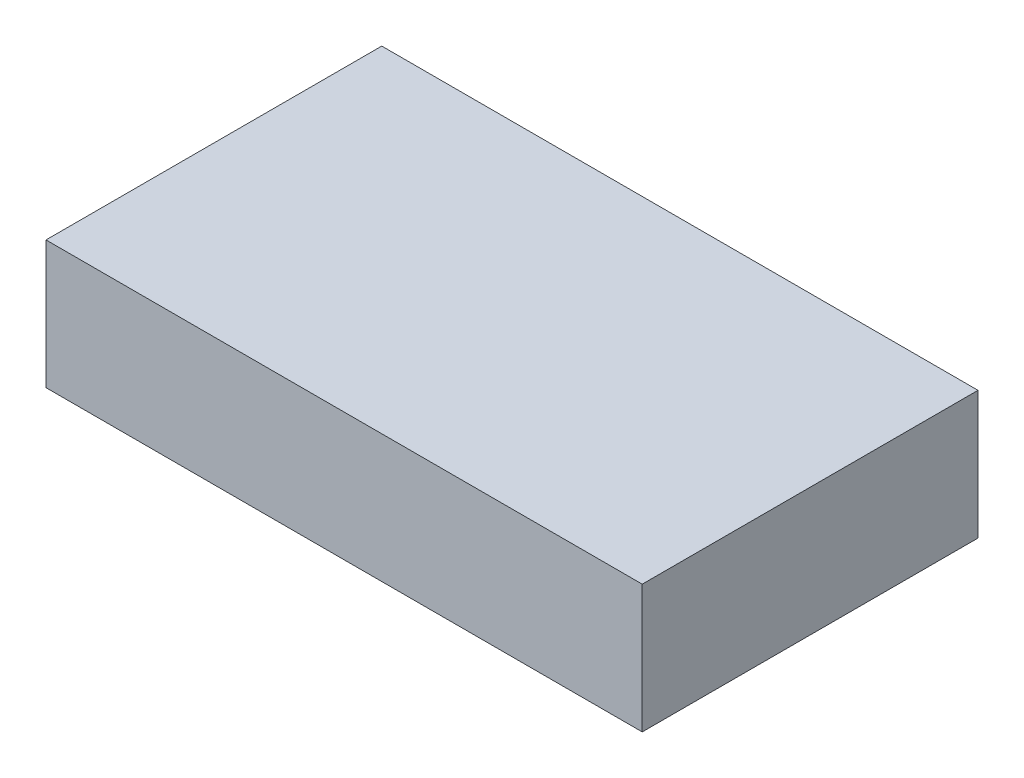
ISO-10303-21;
HEADER;
FILE_DESCRIPTION(('STEP AP214'),'2;1');
FILE_NAME('part.step','',(''),(''),'','','');
FILE_SCHEMA(('AUTOMOTIVE_DESIGN { 1 0 10303 214 1 1 1 1 }'));
ENDSEC;
DATA;
#1=APPLICATION_CONTEXT('core data for automotive mechanical design processes');
#2=APPLICATION_PROTOCOL_DEFINITION('international standard','automotive_design',2000,#1);
#3=PRODUCT_CONTEXT('',#1,'mechanical');
#4=PRODUCT('Part','Part','',(#3));
#5=PRODUCT_RELATED_PRODUCT_CATEGORY('part','',(#4));
#6=PRODUCT_DEFINITION_FORMATION('','',#4);
#7=PRODUCT_DEFINITION_CONTEXT('part definition',#1,'design');
#8=PRODUCT_DEFINITION('design','',#6,#7);
#9=PRODUCT_DEFINITION_SHAPE('','',#8);
#10=(LENGTH_UNIT() NAMED_UNIT(*) SI_UNIT(.MILLI.,.METRE.));
#11=(NAMED_UNIT(*) PLANE_ANGLE_UNIT() SI_UNIT($,.RADIAN.));
#12=(NAMED_UNIT(*) SI_UNIT($,.STERADIAN.) SOLID_ANGLE_UNIT());
#13=UNCERTAINTY_MEASURE_WITH_UNIT(LENGTH_MEASURE(1.E-05),#10,'distance_accuracy_value','');
#14=(GEOMETRIC_REPRESENTATION_CONTEXT(3) GLOBAL_UNCERTAINTY_ASSIGNED_CONTEXT((#13)) GLOBAL_UNIT_ASSIGNED_CONTEXT((#10,
#11,#12)) REPRESENTATION_CONTEXT('',''));
#15=CARTESIAN_POINT('',(0.,0.,0.));
#16=DIRECTION('',(0.,0.,1.));
#17=DIRECTION('',(1.,0.,0.));
#18=AXIS2_PLACEMENT_3D('',#15,#16,#17);
#19=CARTESIAN_POINT('',(-27.2077035353551,6.51983895380681,20.));
#20=DIRECTION('',(1.,0.,0.));
#21=DIRECTION('',(0.,0.,-1.));
#22=AXIS2_PLACEMENT_3D('',#19,#20,#21);
#23=PLANE('',#22);
#24=DIRECTION('',(0.,-1.,0.));
#25=VECTOR('',#24,1.);
#26=CARTESIAN_POINT('',(-27.2077035353551,6.51983895380681,0.));
#27=LINE('',#26,#25);
#28=CARTESIAN_POINT('',(-27.2077035353551,14.1433318347381,0.));
#29=VERTEX_POINT('',#28);
#30=CARTESIAN_POINT('',(-27.2077035353551,6.51983895380681,0.));
#31=VERTEX_POINT('',#30);
#32=EDGE_CURVE('E96',#29,#31,#27,.T.);
#33=ORIENTED_EDGE('',*,*,#32,.T.);
#34=DIRECTION('',(0.,0.,-1.));
#35=VECTOR('',#34,1.);
#36=CARTESIAN_POINT('',(-27.2077035353551,6.51983895380681,20.));
#37=LINE('',#36,#35);
#38=CARTESIAN_POINT('',(-27.2077035353551,6.51983895380681,20.));
#39=VERTEX_POINT('',#38);
#40=EDGE_CURVE('E11',#39,#31,#37,.T.);
#41=ORIENTED_EDGE('',*,*,#40,.F.);
#42=DIRECTION('',(0.,-1.,0.));
#43=VECTOR('',#42,1.);
#44=CARTESIAN_POINT('',(-27.2077035353551,6.51983895380681,20.));
#45=LINE('',#44,#43);
#46=CARTESIAN_POINT('',(-27.2077035353551,14.1433318347381,20.));
#47=VERTEX_POINT('',#46);
#48=EDGE_CURVE('E84',#47,#39,#45,.T.);
#49=ORIENTED_EDGE('',*,*,#48,.F.);
#50=DIRECTION('',(0.,0.,-1.));
#51=VECTOR('',#50,1.);
#52=CARTESIAN_POINT('',(-27.2077035353551,14.1433318347381,20.));
#53=LINE('',#52,#51);
#54=EDGE_CURVE('E92',#47,#29,#53,.T.);
#55=ORIENTED_EDGE('',*,*,#54,.T.);
#56=EDGE_LOOP('',(#33,#41,#49,#55));
#57=FACE_BOUND('',#56,.T.);
#58=ADVANCED_FACE('F33',(#57),#23,.F.);
#59=CARTESIAN_POINT('',(-27.2077035353551,6.51983895380681,20.));
#60=DIRECTION('',(0.,1.,0.));
#61=DIRECTION('',(0.,0.,1.));
#62=AXIS2_PLACEMENT_3D('',#59,#60,#61);
#63=PLANE('',#62);
#64=DIRECTION('',(1.,0.,0.));
#65=VECTOR('',#64,1.);
#66=CARTESIAN_POINT('',(-27.2077035353551,6.51983895380681,0.));
#67=LINE('',#66,#65);
#68=CARTESIAN_POINT('',(8.30885072817544,6.51983895380681,0.));
#69=VERTEX_POINT('',#68);
#70=EDGE_CURVE('E88',#31,#69,#67,.T.);
#71=ORIENTED_EDGE('',*,*,#70,.T.);
#72=DIRECTION('',(0.,0.,-1.));
#73=VECTOR('',#72,1.);
#74=CARTESIAN_POINT('',(8.30885072817544,6.51983895380681,20.));
#75=LINE('',#74,#73);
#76=CARTESIAN_POINT('',(8.30885072817544,6.51983895380681,20.));
#77=VERTEX_POINT('',#76);
#78=EDGE_CURVE('E41',#77,#69,#75,.T.);
#79=ORIENTED_EDGE('',*,*,#78,.F.);
#80=DIRECTION('',(1.,0.,0.));
#81=VECTOR('',#80,1.);
#82=CARTESIAN_POINT('',(-27.2077035353551,6.51983895380681,20.));
#83=LINE('',#82,#81);
#84=EDGE_CURVE('E79',#39,#77,#83,.T.);
#85=ORIENTED_EDGE('',*,*,#84,.F.);
#86=ORIENTED_EDGE('',*,*,#40,.T.);
#87=EDGE_LOOP('',(#71,#79,#85,#86));
#88=FACE_BOUND('',#87,.T.);
#89=ADVANCED_FACE('F87',(#88),#63,.F.);
#90=CARTESIAN_POINT('',(8.30885072817544,6.51983895380681,20.));
#91=DIRECTION('',(-1.,0.,0.));
#92=DIRECTION('',(0.,0.,1.));
#93=AXIS2_PLACEMENT_3D('',#90,#91,#92);
#94=PLANE('',#93);
#95=DIRECTION('',(0.,1.,0.));
#96=VECTOR('',#95,1.);
#97=CARTESIAN_POINT('',(8.30885072817544,6.51983895380681,0.));
#98=LINE('',#97,#96);
#99=CARTESIAN_POINT('',(8.30885072817544,14.1433318347381,0.));
#100=VERTEX_POINT('',#99);
#101=EDGE_CURVE('E66',#69,#100,#98,.T.);
#102=ORIENTED_EDGE('',*,*,#101,.T.);
#103=DIRECTION('',(0.,0.,-1.));
#104=VECTOR('',#103,1.);
#105=CARTESIAN_POINT('',(8.30885072817544,14.1433318347381,20.));
#106=LINE('',#105,#104);
#107=CARTESIAN_POINT('',(8.30885072817544,14.1433318347381,20.));
#108=VERTEX_POINT('',#107);
#109=EDGE_CURVE('E89',#108,#100,#106,.T.);
#110=ORIENTED_EDGE('',*,*,#109,.F.);
#111=DIRECTION('',(0.,1.,0.));
#112=VECTOR('',#111,1.);
#113=CARTESIAN_POINT('',(8.30885072817544,6.51983895380681,20.));
#114=LINE('',#113,#112);
#115=EDGE_CURVE('E82',#77,#108,#114,.T.);
#116=ORIENTED_EDGE('',*,*,#115,.F.);
#117=ORIENTED_EDGE('',*,*,#78,.T.);
#118=EDGE_LOOP('',(#102,#110,#116,#117));
#119=FACE_BOUND('',#118,.T.);
#120=ADVANCED_FACE('F90',(#119),#94,.F.);
#121=CARTESIAN_POINT('',(-27.2077035353551,14.1433318347381,20.));
#122=DIRECTION('',(0.,-1.,0.));
#123=DIRECTION('',(0.,0.,-1.));
#124=AXIS2_PLACEMENT_3D('',#121,#122,#123);
#125=PLANE('',#124);
#126=DIRECTION('',(-1.,0.,0.));
#127=VECTOR('',#126,1.);
#128=CARTESIAN_POINT('',(-27.2077035353551,14.1433318347381,0.));
#129=LINE('',#128,#127);
#130=EDGE_CURVE('E72',#100,#29,#129,.T.);
#131=ORIENTED_EDGE('',*,*,#130,.T.);
#132=ORIENTED_EDGE('',*,*,#54,.F.);
#133=DIRECTION('',(-1.,0.,0.));
#134=VECTOR('',#133,1.);
#135=CARTESIAN_POINT('',(-27.2077035353551,14.1433318347381,20.));
#136=LINE('',#135,#134);
#137=EDGE_CURVE('E49',#108,#47,#136,.T.);
#138=ORIENTED_EDGE('',*,*,#137,.F.);
#139=ORIENTED_EDGE('',*,*,#109,.T.);
#140=EDGE_LOOP('',(#131,#132,#138,#139));
#141=FACE_BOUND('',#140,.T.);
#142=ADVANCED_FACE('F103',(#141),#125,.F.);
#143=CARTESIAN_POINT('',(0.,0.,20.));
#144=DIRECTION('',(0.,0.,-1.));
#145=DIRECTION('',(-1.,0.,0.));
#146=AXIS2_PLACEMENT_3D('',#143,#144,#145);
#147=PLANE('',#146);
#148=ORIENTED_EDGE('',*,*,#48,.T.);
#149=ORIENTED_EDGE('',*,*,#84,.T.);
#150=ORIENTED_EDGE('',*,*,#115,.T.);
#151=ORIENTED_EDGE('',*,*,#137,.T.);
#152=EDGE_LOOP('',(#148,#149,#150,#151));
#153=FACE_BOUND('',#152,.T.);
#154=ADVANCED_FACE('F80',(#153),#147,.F.);
#155=CARTESIAN_POINT('',(0.,0.,0.));
#156=DIRECTION('',(0.,0.,-1.));
#157=DIRECTION('',(-1.,0.,0.));
#158=AXIS2_PLACEMENT_3D('',#155,#156,#157);
#159=PLANE('',#158);
#160=ORIENTED_EDGE('',*,*,#32,.F.);
#161=ORIENTED_EDGE('',*,*,#130,.F.);
#162=ORIENTED_EDGE('',*,*,#101,.F.);
#163=ORIENTED_EDGE('',*,*,#70,.F.);
#164=EDGE_LOOP('',(#160,#161,#162,#163));
#165=FACE_BOUND('',#164,.T.);
#166=ADVANCED_FACE('F106',(#165),#159,.T.);
#167=CLOSED_SHELL('',(#58,#89,#120,#142,#154,#166));
#168=MANIFOLD_SOLID_BREP('B2',#167);
#169=ADVANCED_BREP_SHAPE_REPRESENTATION('',(#18,#168),#14);
#170=SHAPE_DEFINITION_REPRESENTATION(#9,#169);
ENDSEC;
END-ISO-10303-21;
